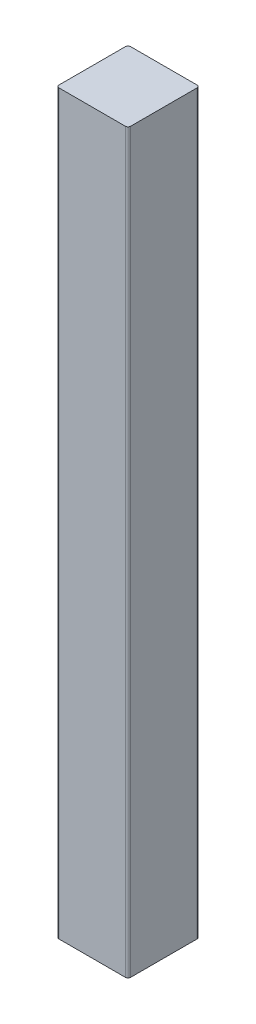
ISO-10303-21;
HEADER;
FILE_DESCRIPTION(('STEP AP214'),'2;1');
FILE_NAME('part.step','',(''),(''),'','','');
FILE_SCHEMA(('AUTOMOTIVE_DESIGN { 1 0 10303 214 1 1 1 1 }'));
ENDSEC;
DATA;
#1=APPLICATION_CONTEXT('core data for automotive mechanical design processes');
#2=APPLICATION_PROTOCOL_DEFINITION('international standard','automotive_design',2000,#1);
#3=PRODUCT_CONTEXT('',#1,'mechanical');
#4=PRODUCT('Part','Part','',(#3));
#5=PRODUCT_RELATED_PRODUCT_CATEGORY('part','',(#4));
#6=PRODUCT_DEFINITION_FORMATION('','',#4);
#7=PRODUCT_DEFINITION_CONTEXT('part definition',#1,'design');
#8=PRODUCT_DEFINITION('design','',#6,#7);
#9=PRODUCT_DEFINITION_SHAPE('','',#8);
#10=(LENGTH_UNIT() NAMED_UNIT(*) SI_UNIT(.MILLI.,.METRE.));
#11=(NAMED_UNIT(*) PLANE_ANGLE_UNIT() SI_UNIT($,.RADIAN.));
#12=(NAMED_UNIT(*) SI_UNIT($,.STERADIAN.) SOLID_ANGLE_UNIT());
#13=UNCERTAINTY_MEASURE_WITH_UNIT(LENGTH_MEASURE(1.E-05),#10,'distance_accuracy_value','');
#14=(GEOMETRIC_REPRESENTATION_CONTEXT(3) GLOBAL_UNCERTAINTY_ASSIGNED_CONTEXT((#13)) GLOBAL_UNIT_ASSIGNED_CONTEXT((#10,
#11,#12)) REPRESENTATION_CONTEXT('',''));
#15=CARTESIAN_POINT('',(0.,0.,0.));
#16=DIRECTION('',(0.,0.,1.));
#17=DIRECTION('',(1.,0.,0.));
#18=AXIS2_PLACEMENT_3D('',#15,#16,#17);
#19=CARTESIAN_POINT('',(44.45,915.9875,-44.45));
#20=DIRECTION('',(-1.,0.,0.));
#21=DIRECTION('',(0.,0.,1.));
#22=AXIS2_PLACEMENT_3D('',#19,#20,#21);
#23=PLANE('',#22);
#24=DIRECTION('',(0.,0.,-1.));
#25=VECTOR('',#24,1.);
#26=CARTESIAN_POINT('',(44.45,0.,-44.45));
#27=LINE('',#26,#25);
#28=CARTESIAN_POINT('',(44.45,0.,41.275));
#29=VERTEX_POINT('',#28);
#30=CARTESIAN_POINT('',(44.45,0.,-41.275));
#31=VERTEX_POINT('',#30);
#32=EDGE_CURVE('E157',#29,#31,#27,.T.);
#33=ORIENTED_EDGE('',*,*,#32,.T.);
#34=DIRECTION('',(0.,-1.,0.));
#35=VECTOR('',#34,1.);
#36=CARTESIAN_POINT('',(44.45,915.9875,-41.275));
#37=LINE('',#36,#35);
#38=CARTESIAN_POINT('',(44.45,915.9875,-41.275));
#39=VERTEX_POINT('',#38);
#40=EDGE_CURVE('E11',#31,#39,#37,.F.);
#41=ORIENTED_EDGE('',*,*,#40,.T.);
#42=DIRECTION('',(0.,0.,-1.));
#43=VECTOR('',#42,1.);
#44=CARTESIAN_POINT('',(44.45,915.9875,-44.45));
#45=LINE('',#44,#43);
#46=CARTESIAN_POINT('',(44.45,915.9875,41.275));
#47=VERTEX_POINT('',#46);
#48=EDGE_CURVE('E125',#47,#39,#45,.T.);
#49=ORIENTED_EDGE('',*,*,#48,.F.);
#50=DIRECTION('',(0.,-1.,0.));
#51=VECTOR('',#50,1.);
#52=CARTESIAN_POINT('',(44.45,915.9875,41.275));
#53=LINE('',#52,#51);
#54=EDGE_CURVE('E41',#47,#29,#53,.T.);
#55=ORIENTED_EDGE('',*,*,#54,.T.);
#56=EDGE_LOOP('',(#33,#41,#49,#55));
#57=FACE_BOUND('',#56,.T.);
#58=ADVANCED_FACE('F33',(#57),#23,.F.);
#59=CARTESIAN_POINT('',(-44.45,915.9875,-44.45));
#60=DIRECTION('',(0.,0.,1.));
#61=DIRECTION('',(1.,0.,0.));
#62=AXIS2_PLACEMENT_3D('',#59,#60,#61);
#63=PLANE('',#62);
#64=DIRECTION('',(-1.,0.,0.));
#65=VECTOR('',#64,1.);
#66=CARTESIAN_POINT('',(-44.45,0.,-44.45));
#67=LINE('',#66,#65);
#68=CARTESIAN_POINT('',(41.275,0.,-44.45));
#69=VERTEX_POINT('',#68);
#70=CARTESIAN_POINT('',(-41.275,0.,-44.45));
#71=VERTEX_POINT('',#70);
#72=EDGE_CURVE('E130',#69,#71,#67,.T.);
#73=ORIENTED_EDGE('',*,*,#72,.T.);
#74=DIRECTION('',(0.,-1.,0.));
#75=VECTOR('',#74,1.);
#76=CARTESIAN_POINT('',(-41.275,915.9875,-44.45));
#77=LINE('',#76,#75);
#78=CARTESIAN_POINT('',(-41.275,915.9875,-44.45));
#79=VERTEX_POINT('',#78);
#80=EDGE_CURVE('E48',#71,#79,#77,.F.);
#81=ORIENTED_EDGE('',*,*,#80,.T.);
#82=DIRECTION('',(-1.,0.,0.));
#83=VECTOR('',#82,1.);
#84=CARTESIAN_POINT('',(-44.45,915.9875,-44.45));
#85=LINE('',#84,#83);
#86=CARTESIAN_POINT('',(41.275,915.9875,-44.45));
#87=VERTEX_POINT('',#86);
#88=EDGE_CURVE('E128',#87,#79,#85,.T.);
#89=ORIENTED_EDGE('',*,*,#88,.F.);
#90=DIRECTION('',(0.,-1.,0.));
#91=VECTOR('',#90,1.);
#92=CARTESIAN_POINT('',(41.275,915.9875,-44.45));
#93=LINE('',#92,#91);
#94=EDGE_CURVE('E149',#87,#69,#93,.T.);
#95=ORIENTED_EDGE('',*,*,#94,.T.);
#96=EDGE_LOOP('',(#73,#81,#89,#95));
#97=FACE_BOUND('',#96,.T.);
#98=ADVANCED_FACE('F177',(#97),#63,.F.);
#99=CARTESIAN_POINT('',(-44.45,915.9875,-44.45));
#100=DIRECTION('',(1.,0.,0.));
#101=DIRECTION('',(0.,0.,-1.));
#102=AXIS2_PLACEMENT_3D('',#99,#100,#101);
#103=PLANE('',#102);
#104=DIRECTION('',(0.,0.,1.));
#105=VECTOR('',#104,1.);
#106=CARTESIAN_POINT('',(-44.45,0.,-44.45));
#107=LINE('',#106,#105);
#108=CARTESIAN_POINT('',(-44.45,0.,-41.275));
#109=VERTEX_POINT('',#108);
#110=CARTESIAN_POINT('',(-44.45,0.,41.275));
#111=VERTEX_POINT('',#110);
#112=EDGE_CURVE('E126',#109,#111,#107,.T.);
#113=ORIENTED_EDGE('',*,*,#112,.T.);
#114=DIRECTION('',(0.,-1.,0.));
#115=VECTOR('',#114,1.);
#116=CARTESIAN_POINT('',(-44.45,915.9875,41.275));
#117=LINE('',#116,#115);
#118=CARTESIAN_POINT('',(-44.45,915.9875,41.275));
#119=VERTEX_POINT('',#118);
#120=EDGE_CURVE('E104',#111,#119,#117,.F.);
#121=ORIENTED_EDGE('',*,*,#120,.T.);
#122=DIRECTION('',(0.,0.,1.));
#123=VECTOR('',#122,1.);
#124=CARTESIAN_POINT('',(-44.45,915.9875,-44.45));
#125=LINE('',#124,#123);
#126=CARTESIAN_POINT('',(-44.45,915.9875,-41.275));
#127=VERTEX_POINT('',#126);
#128=EDGE_CURVE('E165',#127,#119,#125,.T.);
#129=ORIENTED_EDGE('',*,*,#128,.F.);
#130=DIRECTION('',(0.,-1.,0.));
#131=VECTOR('',#130,1.);
#132=CARTESIAN_POINT('',(-44.45,915.9875,-41.275));
#133=LINE('',#132,#131);
#134=EDGE_CURVE('E109',#127,#109,#133,.T.);
#135=ORIENTED_EDGE('',*,*,#134,.T.);
#136=EDGE_LOOP('',(#113,#121,#129,#135));
#137=FACE_BOUND('',#136,.T.);
#138=ADVANCED_FACE('F176',(#137),#103,.F.);
#139=CARTESIAN_POINT('',(-44.45,915.9875,44.45));
#140=DIRECTION('',(0.,0.,-1.));
#141=DIRECTION('',(-1.,0.,0.));
#142=AXIS2_PLACEMENT_3D('',#139,#140,#141);
#143=PLANE('',#142);
#144=DIRECTION('',(1.,0.,0.));
#145=VECTOR('',#144,1.);
#146=CARTESIAN_POINT('',(-44.45,915.9875,44.45));
#147=LINE('',#146,#145);
#148=CARTESIAN_POINT('',(-41.275,915.9875,44.45));
#149=VERTEX_POINT('',#148);
#150=CARTESIAN_POINT('',(41.275,915.9875,44.45));
#151=VERTEX_POINT('',#150);
#152=EDGE_CURVE('E119',#149,#151,#147,.T.);
#153=ORIENTED_EDGE('',*,*,#152,.F.);
#154=DIRECTION('',(0.,-1.,0.));
#155=VECTOR('',#154,1.);
#156=CARTESIAN_POINT('',(-41.275,915.9875,44.45));
#157=LINE('',#156,#155);
#158=CARTESIAN_POINT('',(-41.275,0.,44.45));
#159=VERTEX_POINT('',#158);
#160=EDGE_CURVE('E103',#149,#159,#157,.T.);
#161=ORIENTED_EDGE('',*,*,#160,.T.);
#162=DIRECTION('',(1.,0.,0.));
#163=VECTOR('',#162,1.);
#164=CARTESIAN_POINT('',(-44.45,0.,44.45));
#165=LINE('',#164,#163);
#166=CARTESIAN_POINT('',(41.275,0.,44.45));
#167=VERTEX_POINT('',#166);
#168=EDGE_CURVE('E116',#159,#167,#165,.T.);
#169=ORIENTED_EDGE('',*,*,#168,.T.);
#170=DIRECTION('',(0.,-1.,0.));
#171=VECTOR('',#170,1.);
#172=CARTESIAN_POINT('',(41.275,915.9875,44.45));
#173=LINE('',#172,#171);
#174=EDGE_CURVE('E121',#167,#151,#173,.F.);
#175=ORIENTED_EDGE('',*,*,#174,.T.);
#176=EDGE_LOOP('',(#153,#161,#169,#175));
#177=FACE_BOUND('',#176,.T.);
#178=ADVANCED_FACE('F115',(#177),#143,.F.);
#179=CARTESIAN_POINT('',(0.,915.9875,0.));
#180=DIRECTION('',(0.,1.,0.));
#181=DIRECTION('',(0.,0.,1.));
#182=AXIS2_PLACEMENT_3D('',#179,#180,#181);
#183=PLANE('',#182);
#184=ORIENTED_EDGE('',*,*,#128,.T.);
#185=CARTESIAN_POINT('',(-41.275,915.9875,41.275));
#186=DIRECTION('',(0.,1.,0.));
#187=DIRECTION('',(0.,0.,1.));
#188=AXIS2_PLACEMENT_3D('',#185,#186,#187);
#189=CIRCLE('',#188,3.175);
#190=EDGE_CURVE('E147',#119,#149,#189,.T.);
#191=ORIENTED_EDGE('',*,*,#190,.T.);
#192=ORIENTED_EDGE('',*,*,#152,.T.);
#193=CARTESIAN_POINT('',(41.275,915.9875,41.275));
#194=DIRECTION('',(0.,1.,0.));
#195=DIRECTION('',(0.,0.,1.));
#196=AXIS2_PLACEMENT_3D('',#193,#194,#195);
#197=CIRCLE('',#196,3.175);
#198=EDGE_CURVE('E142',#151,#47,#197,.T.);
#199=ORIENTED_EDGE('',*,*,#198,.T.);
#200=ORIENTED_EDGE('',*,*,#48,.T.);
#201=CARTESIAN_POINT('',(41.275,915.9875,-41.275));
#202=DIRECTION('',(0.,1.,0.));
#203=DIRECTION('',(0.,0.,1.));
#204=AXIS2_PLACEMENT_3D('',#201,#202,#203);
#205=CIRCLE('',#204,3.175);
#206=EDGE_CURVE('E55',#39,#87,#205,.T.);
#207=ORIENTED_EDGE('',*,*,#206,.T.);
#208=ORIENTED_EDGE('',*,*,#88,.T.);
#209=CARTESIAN_POINT('',(-41.275,915.9875,-41.275));
#210=DIRECTION('',(0.,1.,0.));
#211=DIRECTION('',(0.,0.,1.));
#212=AXIS2_PLACEMENT_3D('',#209,#210,#211);
#213=CIRCLE('',#212,3.175);
#214=EDGE_CURVE('E145',#79,#127,#213,.T.);
#215=ORIENTED_EDGE('',*,*,#214,.T.);
#216=EDGE_LOOP('',(#184,#191,#192,#199,#200,#207,#208,#215));
#217=FACE_BOUND('',#216,.T.);
#218=ADVANCED_FACE('F169',(#217),#183,.T.);
#219=CARTESIAN_POINT('',(0.,0.,0.));
#220=DIRECTION('',(0.,1.,0.));
#221=DIRECTION('',(0.,0.,1.));
#222=AXIS2_PLACEMENT_3D('',#219,#220,#221);
#223=PLANE('',#222);
#224=ORIENTED_EDGE('',*,*,#168,.F.);
#225=CARTESIAN_POINT('',(-41.275,0.,41.275));
#226=DIRECTION('',(0.,1.,0.));
#227=DIRECTION('',(0.,0.,1.));
#228=AXIS2_PLACEMENT_3D('',#225,#226,#227);
#229=CIRCLE('',#228,3.175);
#230=EDGE_CURVE('E99',#159,#111,#229,.F.);
#231=ORIENTED_EDGE('',*,*,#230,.T.);
#232=ORIENTED_EDGE('',*,*,#112,.F.);
#233=CARTESIAN_POINT('',(-41.275,0.,-41.275));
#234=DIRECTION('',(0.,1.,0.));
#235=DIRECTION('',(0.,0.,1.));
#236=AXIS2_PLACEMENT_3D('',#233,#234,#235);
#237=CIRCLE('',#236,3.175);
#238=EDGE_CURVE('E110',#109,#71,#237,.F.);
#239=ORIENTED_EDGE('',*,*,#238,.T.);
#240=ORIENTED_EDGE('',*,*,#72,.F.);
#241=CARTESIAN_POINT('',(41.275,0.,-41.275));
#242=DIRECTION('',(0.,1.,0.));
#243=DIRECTION('',(0.,0.,1.));
#244=AXIS2_PLACEMENT_3D('',#241,#242,#243);
#245=CIRCLE('',#244,3.175);
#246=EDGE_CURVE('E136',#69,#31,#245,.F.);
#247=ORIENTED_EDGE('',*,*,#246,.T.);
#248=ORIENTED_EDGE('',*,*,#32,.F.);
#249=CARTESIAN_POINT('',(41.275,0.,41.275));
#250=DIRECTION('',(0.,1.,0.));
#251=DIRECTION('',(0.,0.,1.));
#252=AXIS2_PLACEMENT_3D('',#249,#250,#251);
#253=CIRCLE('',#252,3.175);
#254=EDGE_CURVE('E120',#29,#167,#253,.F.);
#255=ORIENTED_EDGE('',*,*,#254,.T.);
#256=EDGE_LOOP('',(#224,#231,#232,#239,#240,#247,#248,#255));
#257=FACE_BOUND('',#256,.T.);
#258=ADVANCED_FACE('F123',(#257),#223,.F.);
#259=CARTESIAN_POINT('',(-41.275,915.9875,41.275));
#260=DIRECTION('',(0.,-1.,0.));
#261=DIRECTION('',(0.,0.,-1.));
#262=AXIS2_PLACEMENT_3D('',#259,#260,#261);
#263=CYLINDRICAL_SURFACE('',#262,3.175);
#264=ORIENTED_EDGE('',*,*,#190,.F.);
#265=ORIENTED_EDGE('',*,*,#120,.F.);
#266=ORIENTED_EDGE('',*,*,#230,.F.);
#267=ORIENTED_EDGE('',*,*,#160,.F.);
#268=EDGE_LOOP('',(#264,#265,#266,#267));
#269=FACE_BOUND('',#268,.T.);
#270=ADVANCED_FACE('F102',(#269),#263,.T.);
#271=CARTESIAN_POINT('',(-41.275,915.9875,-41.275));
#272=DIRECTION('',(0.,-1.,0.));
#273=DIRECTION('',(0.,0.,-1.));
#274=AXIS2_PLACEMENT_3D('',#271,#272,#273);
#275=CYLINDRICAL_SURFACE('',#274,3.175);
#276=ORIENTED_EDGE('',*,*,#214,.F.);
#277=ORIENTED_EDGE('',*,*,#80,.F.);
#278=ORIENTED_EDGE('',*,*,#238,.F.);
#279=ORIENTED_EDGE('',*,*,#134,.F.);
#280=EDGE_LOOP('',(#276,#277,#278,#279));
#281=FACE_BOUND('',#280,.T.);
#282=ADVANCED_FACE('F174',(#281),#275,.T.);
#283=CARTESIAN_POINT('',(41.275,915.9875,-41.275));
#284=DIRECTION('',(0.,-1.,0.));
#285=DIRECTION('',(0.,0.,-1.));
#286=AXIS2_PLACEMENT_3D('',#283,#284,#285);
#287=CYLINDRICAL_SURFACE('',#286,3.175);
#288=ORIENTED_EDGE('',*,*,#206,.F.);
#289=ORIENTED_EDGE('',*,*,#40,.F.);
#290=ORIENTED_EDGE('',*,*,#246,.F.);
#291=ORIENTED_EDGE('',*,*,#94,.F.);
#292=EDGE_LOOP('',(#288,#289,#290,#291));
#293=FACE_BOUND('',#292,.T.);
#294=ADVANCED_FACE('F179',(#293),#287,.T.);
#295=CARTESIAN_POINT('',(41.275,915.9875,41.275));
#296=DIRECTION('',(0.,-1.,0.));
#297=DIRECTION('',(0.,0.,-1.));
#298=AXIS2_PLACEMENT_3D('',#295,#296,#297);
#299=CYLINDRICAL_SURFACE('',#298,3.175);
#300=ORIENTED_EDGE('',*,*,#198,.F.);
#301=ORIENTED_EDGE('',*,*,#174,.F.);
#302=ORIENTED_EDGE('',*,*,#254,.F.);
#303=ORIENTED_EDGE('',*,*,#54,.F.);
#304=EDGE_LOOP('',(#300,#301,#302,#303));
#305=FACE_BOUND('',#304,.T.);
#306=ADVANCED_FACE('F35',(#305),#299,.T.);
#307=CLOSED_SHELL('',(#58,#98,#138,#178,#218,#258,#270,#282,#294,#306));
#308=MANIFOLD_SOLID_BREP('B2',#307);
#309=ADVANCED_BREP_SHAPE_REPRESENTATION('',(#18,#308),#14);
#310=SHAPE_DEFINITION_REPRESENTATION(#9,#309);
ENDSEC;
END-ISO-10303-21;
